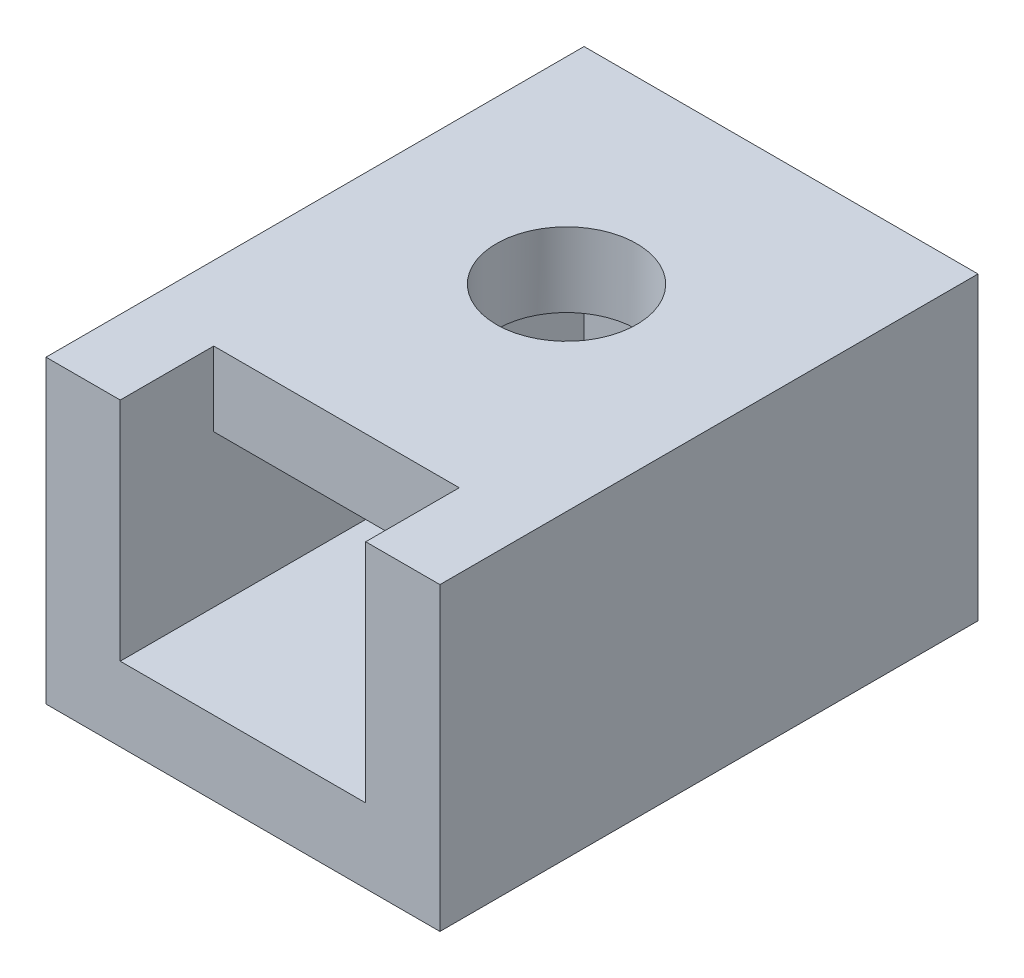
ISO-10303-21;
HEADER;
FILE_DESCRIPTION(('STEP AP214'),'2;1');
FILE_NAME('part.step','',(''),(''),'','','');
FILE_SCHEMA(('AUTOMOTIVE_DESIGN { 1 0 10303 214 1 1 1 1 }'));
ENDSEC;
DATA;
#1=APPLICATION_CONTEXT('core data for automotive mechanical design processes');
#2=APPLICATION_PROTOCOL_DEFINITION('international standard','automotive_design',2000,#1);
#3=PRODUCT_CONTEXT('',#1,'mechanical');
#4=PRODUCT('Part','Part','',(#3));
#5=PRODUCT_RELATED_PRODUCT_CATEGORY('part','',(#4));
#6=PRODUCT_DEFINITION_FORMATION('','',#4);
#7=PRODUCT_DEFINITION_CONTEXT('part definition',#1,'design');
#8=PRODUCT_DEFINITION('design','',#6,#7);
#9=PRODUCT_DEFINITION_SHAPE('','',#8);
#10=(LENGTH_UNIT() NAMED_UNIT(*) SI_UNIT(.MILLI.,.METRE.));
#11=(NAMED_UNIT(*) PLANE_ANGLE_UNIT() SI_UNIT($,.RADIAN.));
#12=(NAMED_UNIT(*) SI_UNIT($,.STERADIAN.) SOLID_ANGLE_UNIT());
#13=UNCERTAINTY_MEASURE_WITH_UNIT(LENGTH_MEASURE(1.E-05),#10,'distance_accuracy_value','');
#14=(GEOMETRIC_REPRESENTATION_CONTEXT(3) GLOBAL_UNCERTAINTY_ASSIGNED_CONTEXT((#13)) GLOBAL_UNIT_ASSIGNED_CONTEXT((#10,
#11,#12)) REPRESENTATION_CONTEXT('',''));
#15=CARTESIAN_POINT('',(0.,0.,0.));
#16=DIRECTION('',(0.,0.,1.));
#17=DIRECTION('',(1.,0.,0.));
#18=AXIS2_PLACEMENT_3D('',#15,#16,#17);
#19=CARTESIAN_POINT('',(0.,0.,19.84));
#20=DIRECTION('',(0.,0.,-1.));
#21=DIRECTION('',(-1.,0.,0.));
#22=AXIS2_PLACEMENT_3D('',#19,#20,#21);
#23=PLANE('',#22);
#24=DIRECTION('',(0.,-1.,0.));
#25=VECTOR('',#24,1.);
#26=CARTESIAN_POINT('',(-5.25,-3.25,19.84));
#27=LINE('',#26,#25);
#28=CARTESIAN_POINT('',(-5.25,6.425,19.84));
#29=VERTEX_POINT('',#28);
#30=CARTESIAN_POINT('',(-5.25,-3.25,19.84));
#31=VERTEX_POINT('',#30);
#32=EDGE_CURVE('E168',#29,#31,#27,.T.);
#33=ORIENTED_EDGE('',*,*,#32,.F.);
#34=DIRECTION('',(-1.,0.,0.));
#35=VECTOR('',#34,1.);
#36=CARTESIAN_POINT('',(0.,6.425,19.84));
#37=LINE('',#36,#35);
#38=CARTESIAN_POINT('',(-8.42500000000001,6.425,19.84));
#39=VERTEX_POINT('',#38);
#40=EDGE_CURVE('E147',#29,#39,#37,.T.);
#41=ORIENTED_EDGE('',*,*,#40,.T.);
#42=DIRECTION('',(0.,-1.,0.));
#43=VECTOR('',#42,1.);
#44=CARTESIAN_POINT('',(-8.42500000000001,0.,19.84));
#45=LINE('',#44,#43);
#46=CARTESIAN_POINT('',(-8.42500000000001,-6.425,19.84));
#47=VERTEX_POINT('',#46);
#48=EDGE_CURVE('E228',#39,#47,#45,.T.);
#49=ORIENTED_EDGE('',*,*,#48,.T.);
#50=DIRECTION('',(1.,0.,0.));
#51=VECTOR('',#50,1.);
#52=CARTESIAN_POINT('',(0.,-6.425,19.84));
#53=LINE('',#52,#51);
#54=CARTESIAN_POINT('',(8.425,-6.425,19.84));
#55=VERTEX_POINT('',#54);
#56=EDGE_CURVE('E43',#47,#55,#53,.T.);
#57=ORIENTED_EDGE('',*,*,#56,.T.);
#58=DIRECTION('',(0.,1.,0.));
#59=VECTOR('',#58,1.);
#60=CARTESIAN_POINT('',(8.425,0.,19.84));
#61=LINE('',#60,#59);
#62=CARTESIAN_POINT('',(8.425,6.425,19.84));
#63=VERTEX_POINT('',#62);
#64=EDGE_CURVE('E222',#55,#63,#61,.T.);
#65=ORIENTED_EDGE('',*,*,#64,.T.);
#66=CARTESIAN_POINT('',(5.25,6.425,19.84));
#67=VERTEX_POINT('',#66);
#68=EDGE_CURVE('E225',#63,#67,#37,.T.);
#69=ORIENTED_EDGE('',*,*,#68,.T.);
#70=DIRECTION('',(0.,1.,0.));
#71=VECTOR('',#70,1.);
#72=CARTESIAN_POINT('',(5.25,-3.25,19.84));
#73=LINE('',#72,#71);
#74=CARTESIAN_POINT('',(5.25,-3.25,19.84));
#75=VERTEX_POINT('',#74);
#76=EDGE_CURVE('E165',#75,#67,#73,.T.);
#77=ORIENTED_EDGE('',*,*,#76,.F.);
#78=DIRECTION('',(1.,0.,0.));
#79=VECTOR('',#78,1.);
#80=CARTESIAN_POINT('',(-5.25,-3.25,19.84));
#81=LINE('',#80,#79);
#82=EDGE_CURVE('E172',#31,#75,#81,.T.);
#83=ORIENTED_EDGE('',*,*,#82,.F.);
#84=EDGE_LOOP('',(#33,#41,#49,#57,#65,#69,#77,#83));
#85=FACE_BOUND('',#84,.T.);
#86=ADVANCED_FACE('F39',(#85),#23,.F.);
#87=CARTESIAN_POINT('',(8.425,-3.25,19.84));
#88=DIRECTION('',(-1.,0.,0.));
#89=DIRECTION('',(0.,0.,1.));
#90=AXIS2_PLACEMENT_3D('',#87,#88,#89);
#91=PLANE('',#90);
#92=DIRECTION('',(0.,1.,0.));
#93=VECTOR('',#92,1.);
#94=CARTESIAN_POINT('',(8.425,0.,-3.175));
#95=LINE('',#94,#93);
#96=CARTESIAN_POINT('',(8.425,-6.425,-3.175));
#97=VERTEX_POINT('',#96);
#98=CARTESIAN_POINT('',(8.425,6.425,-3.175));
#99=VERTEX_POINT('',#98);
#100=EDGE_CURVE('E198',#97,#99,#95,.T.);
#101=ORIENTED_EDGE('',*,*,#100,.T.);
#102=DIRECTION('',(0.,0.,-1.));
#103=VECTOR('',#102,1.);
#104=CARTESIAN_POINT('',(8.425,6.425,19.84));
#105=LINE('',#104,#103);
#106=EDGE_CURVE('E11',#63,#99,#105,.T.);
#107=ORIENTED_EDGE('',*,*,#106,.F.);
#108=ORIENTED_EDGE('',*,*,#64,.F.);
#109=DIRECTION('',(0.,0.,-1.));
#110=VECTOR('',#109,1.);
#111=CARTESIAN_POINT('',(8.425,-6.425,19.84));
#112=LINE('',#111,#110);
#113=EDGE_CURVE('E203',#55,#97,#112,.T.);
#114=ORIENTED_EDGE('',*,*,#113,.T.);
#115=EDGE_LOOP('',(#101,#107,#108,#114));
#116=FACE_BOUND('',#115,.T.);
#117=ADVANCED_FACE('F243',(#116),#91,.F.);
#118=CARTESIAN_POINT('',(-5.25,6.425,19.84));
#119=DIRECTION('',(0.,-1.,0.));
#120=DIRECTION('',(0.,0.,-1.));
#121=AXIS2_PLACEMENT_3D('',#118,#119,#120);
#122=PLANE('',#121);
#123=CARTESIAN_POINT('',(0.,6.425,6.));
#124=DIRECTION('',(0.,1.,0.));
#125=DIRECTION('',(0.,0.,1.));
#126=AXIS2_PLACEMENT_3D('',#123,#124,#125);
#127=CIRCLE('',#126,3.);
#128=CARTESIAN_POINT('',(0.,6.425,9.));
#129=VERTEX_POINT('',#128);
#130=EDGE_CURVE('E156',#129,#129,#127,.T.);
#131=ORIENTED_EDGE('',*,*,#130,.F.);
#132=EDGE_LOOP('',(#131));
#133=FACE_BOUND('',#132,.T.);
#134=ORIENTED_EDGE('',*,*,#40,.F.);
#135=DIRECTION('',(0.,0.,1.));
#136=VECTOR('',#135,1.);
#137=CARTESIAN_POINT('',(-5.25,6.425,19.84));
#138=LINE('',#137,#136);
#139=CARTESIAN_POINT('',(-5.25,6.425,15.84));
#140=VERTEX_POINT('',#139);
#141=EDGE_CURVE('E125',#140,#29,#138,.T.);
#142=ORIENTED_EDGE('',*,*,#141,.F.);
#143=DIRECTION('',(-1.,0.,0.));
#144=VECTOR('',#143,1.);
#145=CARTESIAN_POINT('',(-5.25,6.425,15.84));
#146=LINE('',#145,#144);
#147=CARTESIAN_POINT('',(5.25,6.425,15.84));
#148=VERTEX_POINT('',#147);
#149=EDGE_CURVE('E135',#148,#140,#146,.T.);
#150=ORIENTED_EDGE('',*,*,#149,.F.);
#151=DIRECTION('',(0.,0.,-1.));
#152=VECTOR('',#151,1.);
#153=CARTESIAN_POINT('',(5.25,6.425,19.84));
#154=LINE('',#153,#152);
#155=EDGE_CURVE('E143',#67,#148,#154,.T.);
#156=ORIENTED_EDGE('',*,*,#155,.F.);
#157=ORIENTED_EDGE('',*,*,#68,.F.);
#158=ORIENTED_EDGE('',*,*,#106,.T.);
#159=DIRECTION('',(-1.,0.,0.));
#160=VECTOR('',#159,1.);
#161=CARTESIAN_POINT('',(0.,6.425,-3.175));
#162=LINE('',#161,#160);
#163=CARTESIAN_POINT('',(-8.42500000000001,6.425,-3.175));
#164=VERTEX_POINT('',#163);
#165=EDGE_CURVE('E201',#99,#164,#162,.T.);
#166=ORIENTED_EDGE('',*,*,#165,.T.);
#167=DIRECTION('',(0.,0.,-1.));
#168=VECTOR('',#167,1.);
#169=CARTESIAN_POINT('',(-8.42500000000001,6.425,19.84));
#170=LINE('',#169,#168);
#171=EDGE_CURVE('E49',#39,#164,#170,.T.);
#172=ORIENTED_EDGE('',*,*,#171,.F.);
#173=EDGE_LOOP('',(#134,#142,#150,#156,#157,#158,#166,#172));
#174=FACE_BOUND('',#173,.T.);
#175=ADVANCED_FACE('F145',(#133,#174),#122,.F.);
#176=CARTESIAN_POINT('',(-8.42500000000001,-3.25,19.84));
#177=DIRECTION('',(1.,0.,0.));
#178=DIRECTION('',(0.,0.,-1.));
#179=AXIS2_PLACEMENT_3D('',#176,#177,#178);
#180=PLANE('',#179);
#181=DIRECTION('',(0.,-1.,0.));
#182=VECTOR('',#181,1.);
#183=CARTESIAN_POINT('',(-8.42500000000001,0.,-3.175));
#184=LINE('',#183,#182);
#185=CARTESIAN_POINT('',(-8.42500000000001,-6.425,-3.175));
#186=VERTEX_POINT('',#185);
#187=EDGE_CURVE('E210',#164,#186,#184,.T.);
#188=ORIENTED_EDGE('',*,*,#187,.T.);
#189=DIRECTION('',(0.,0.,-1.));
#190=VECTOR('',#189,1.);
#191=CARTESIAN_POINT('',(-8.42500000000001,-6.425,19.84));
#192=LINE('',#191,#190);
#193=EDGE_CURVE('E207',#47,#186,#192,.T.);
#194=ORIENTED_EDGE('',*,*,#193,.F.);
#195=ORIENTED_EDGE('',*,*,#48,.F.);
#196=ORIENTED_EDGE('',*,*,#171,.T.);
#197=EDGE_LOOP('',(#188,#194,#195,#196));
#198=FACE_BOUND('',#197,.T.);
#199=ADVANCED_FACE('F234',(#198),#180,.F.);
#200=CARTESIAN_POINT('',(-5.25,-6.425,19.84));
#201=DIRECTION('',(0.,1.,0.));
#202=DIRECTION('',(0.,0.,1.));
#203=AXIS2_PLACEMENT_3D('',#200,#201,#202);
#204=PLANE('',#203);
#205=DIRECTION('',(1.,0.,0.));
#206=VECTOR('',#205,1.);
#207=CARTESIAN_POINT('',(0.,-6.425,-3.175));
#208=LINE('',#207,#206);
#209=EDGE_CURVE('E216',#186,#97,#208,.T.);
#210=ORIENTED_EDGE('',*,*,#209,.T.);
#211=ORIENTED_EDGE('',*,*,#113,.F.);
#212=ORIENTED_EDGE('',*,*,#56,.F.);
#213=ORIENTED_EDGE('',*,*,#193,.T.);
#214=EDGE_LOOP('',(#210,#211,#212,#213));
#215=FACE_BOUND('',#214,.T.);
#216=ADVANCED_FACE('F238',(#215),#204,.F.);
#217=CARTESIAN_POINT('',(0.,0.,-3.175));
#218=DIRECTION('',(0.,0.,-1.));
#219=DIRECTION('',(-1.,0.,0.));
#220=AXIS2_PLACEMENT_3D('',#217,#218,#219);
#221=PLANE('',#220);
#222=ORIENTED_EDGE('',*,*,#100,.F.);
#223=ORIENTED_EDGE('',*,*,#209,.F.);
#224=ORIENTED_EDGE('',*,*,#187,.F.);
#225=ORIENTED_EDGE('',*,*,#165,.F.);
#226=EDGE_LOOP('',(#222,#223,#224,#225));
#227=FACE_BOUND('',#226,.T.);
#228=ADVANCED_FACE('F41',(#227),#221,.T.);
#229=CARTESIAN_POINT('',(5.25,-3.25,19.84));
#230=DIRECTION('',(-1.,0.,0.));
#231=DIRECTION('',(0.,0.,1.));
#232=AXIS2_PLACEMENT_3D('',#229,#230,#231);
#233=PLANE('',#232);
#234=DIRECTION('',(0.,1.,0.));
#235=VECTOR('',#234,1.);
#236=CARTESIAN_POINT('',(5.25,-3.25,0.));
#237=LINE('',#236,#235);
#238=CARTESIAN_POINT('',(5.25,-3.25,0.));
#239=VERTEX_POINT('',#238);
#240=CARTESIAN_POINT('',(5.25,3.25,0.));
#241=VERTEX_POINT('',#240);
#242=EDGE_CURVE('E142',#239,#241,#237,.T.);
#243=ORIENTED_EDGE('',*,*,#242,.F.);
#244=DIRECTION('',(0.,0.,-1.));
#245=VECTOR('',#244,1.);
#246=CARTESIAN_POINT('',(5.25,-3.25,19.84));
#247=LINE('',#246,#245);
#248=EDGE_CURVE('E175',#75,#239,#247,.T.);
#249=ORIENTED_EDGE('',*,*,#248,.F.);
#250=ORIENTED_EDGE('',*,*,#76,.T.);
#251=ORIENTED_EDGE('',*,*,#155,.T.);
#252=DIRECTION('',(0.,1.,0.));
#253=VECTOR('',#252,1.);
#254=CARTESIAN_POINT('',(5.25,-6.426,15.84));
#255=LINE('',#254,#253);
#256=CARTESIAN_POINT('',(5.25,3.25,15.84));
#257=VERTEX_POINT('',#256);
#258=EDGE_CURVE('E131',#257,#148,#255,.T.);
#259=ORIENTED_EDGE('',*,*,#258,.F.);
#260=DIRECTION('',(0.,0.,-1.));
#261=VECTOR('',#260,1.);
#262=CARTESIAN_POINT('',(5.25,3.25,19.84));
#263=LINE('',#262,#261);
#264=EDGE_CURVE('E195',#257,#241,#263,.T.);
#265=ORIENTED_EDGE('',*,*,#264,.T.);
#266=EDGE_LOOP('',(#243,#249,#250,#251,#259,#265));
#267=FACE_BOUND('',#266,.T.);
#268=ADVANCED_FACE('F248',(#267),#233,.T.);
#269=CARTESIAN_POINT('',(-5.25,3.25,19.84));
#270=DIRECTION('',(0.,-1.,0.));
#271=DIRECTION('',(0.,0.,-1.));
#272=AXIS2_PLACEMENT_3D('',#269,#270,#271);
#273=PLANE('',#272);
#274=DIRECTION('',(-1.,0.,0.));
#275=VECTOR('',#274,1.);
#276=CARTESIAN_POINT('',(-5.25,3.25,15.84));
#277=LINE('',#276,#275);
#278=CARTESIAN_POINT('',(-5.25,3.25,15.84));
#279=VERTEX_POINT('',#278);
#280=EDGE_CURVE('E132',#257,#279,#277,.T.);
#281=ORIENTED_EDGE('',*,*,#280,.T.);
#282=DIRECTION('',(0.,0.,-1.));
#283=VECTOR('',#282,1.);
#284=CARTESIAN_POINT('',(-5.25,3.25,19.84));
#285=LINE('',#284,#283);
#286=CARTESIAN_POINT('',(-5.25,3.25,0.));
#287=VERTEX_POINT('',#286);
#288=EDGE_CURVE('E127',#279,#287,#285,.T.);
#289=ORIENTED_EDGE('',*,*,#288,.T.);
#290=DIRECTION('',(-1.,0.,0.));
#291=VECTOR('',#290,1.);
#292=CARTESIAN_POINT('',(-5.25,3.25,0.));
#293=LINE('',#292,#291);
#294=EDGE_CURVE('E179',#241,#287,#293,.T.);
#295=ORIENTED_EDGE('',*,*,#294,.F.);
#296=ORIENTED_EDGE('',*,*,#264,.F.);
#297=EDGE_LOOP('',(#281,#289,#295,#296));
#298=FACE_BOUND('',#297,.T.);
#299=CARTESIAN_POINT('',(0.,3.25,6.));
#300=DIRECTION('',(0.,-1.,0.));
#301=DIRECTION('',(0.,0.,-1.));
#302=AXIS2_PLACEMENT_3D('',#299,#300,#301);
#303=CIRCLE('',#302,3.);
#304=CARTESIAN_POINT('',(0.,3.25,3.));
#305=VERTEX_POINT('',#304);
#306=EDGE_CURVE('E158',#305,#305,#303,.F.);
#307=ORIENTED_EDGE('',*,*,#306,.T.);
#308=EDGE_LOOP('',(#307));
#309=FACE_BOUND('',#308,.T.);
#310=ADVANCED_FACE('F256',(#298,#309),#273,.T.);
#311=CARTESIAN_POINT('',(-5.25,-3.25,19.84));
#312=DIRECTION('',(1.,0.,0.));
#313=DIRECTION('',(0.,0.,-1.));
#314=AXIS2_PLACEMENT_3D('',#311,#312,#313);
#315=PLANE('',#314);
#316=DIRECTION('',(0.,-1.,0.));
#317=VECTOR('',#316,1.);
#318=CARTESIAN_POINT('',(-5.25,-3.25,0.));
#319=LINE('',#318,#317);
#320=CARTESIAN_POINT('',(-5.25,-3.25,0.));
#321=VERTEX_POINT('',#320);
#322=EDGE_CURVE('E183',#287,#321,#319,.T.);
#323=ORIENTED_EDGE('',*,*,#322,.F.);
#324=ORIENTED_EDGE('',*,*,#288,.F.);
#325=DIRECTION('',(0.,1.,0.));
#326=VECTOR('',#325,1.);
#327=CARTESIAN_POINT('',(-5.25,-6.426,15.84));
#328=LINE('',#327,#326);
#329=EDGE_CURVE('E120',#279,#140,#328,.T.);
#330=ORIENTED_EDGE('',*,*,#329,.T.);
#331=ORIENTED_EDGE('',*,*,#141,.T.);
#332=ORIENTED_EDGE('',*,*,#32,.T.);
#333=DIRECTION('',(0.,0.,-1.));
#334=VECTOR('',#333,1.);
#335=CARTESIAN_POINT('',(-5.25,-3.25,19.84));
#336=LINE('',#335,#334);
#337=EDGE_CURVE('E57',#31,#321,#336,.T.);
#338=ORIENTED_EDGE('',*,*,#337,.T.);
#339=EDGE_LOOP('',(#323,#324,#330,#331,#332,#338));
#340=FACE_BOUND('',#339,.T.);
#341=ADVANCED_FACE('F123',(#340),#315,.T.);
#342=CARTESIAN_POINT('',(-5.25,-3.25,19.84));
#343=DIRECTION('',(0.,1.,0.));
#344=DIRECTION('',(0.,0.,1.));
#345=AXIS2_PLACEMENT_3D('',#342,#343,#344);
#346=PLANE('',#345);
#347=DIRECTION('',(1.,0.,0.));
#348=VECTOR('',#347,1.);
#349=CARTESIAN_POINT('',(-5.25,-3.25,0.));
#350=LINE('',#349,#348);
#351=EDGE_CURVE('E169',#321,#239,#350,.T.);
#352=ORIENTED_EDGE('',*,*,#351,.F.);
#353=ORIENTED_EDGE('',*,*,#337,.F.);
#354=ORIENTED_EDGE('',*,*,#82,.T.);
#355=ORIENTED_EDGE('',*,*,#248,.T.);
#356=EDGE_LOOP('',(#352,#353,#354,#355));
#357=FACE_BOUND('',#356,.T.);
#358=ADVANCED_FACE('F251',(#357),#346,.T.);
#359=CARTESIAN_POINT('',(0.,0.,0.));
#360=DIRECTION('',(0.,0.,-1.));
#361=DIRECTION('',(-1.,0.,0.));
#362=AXIS2_PLACEMENT_3D('',#359,#360,#361);
#363=PLANE('',#362);
#364=ORIENTED_EDGE('',*,*,#242,.T.);
#365=ORIENTED_EDGE('',*,*,#294,.T.);
#366=ORIENTED_EDGE('',*,*,#322,.T.);
#367=ORIENTED_EDGE('',*,*,#351,.T.);
#368=EDGE_LOOP('',(#364,#365,#366,#367));
#369=FACE_BOUND('',#368,.T.);
#370=ADVANCED_FACE('F253',(#369),#363,.F.);
#371=CARTESIAN_POINT('',(-5.25,-6.426,15.84));
#372=DIRECTION('',(0.,0.,-1.));
#373=DIRECTION('',(-1.,0.,0.));
#374=AXIS2_PLACEMENT_3D('',#371,#372,#373);
#375=PLANE('',#374);
#376=ORIENTED_EDGE('',*,*,#258,.T.);
#377=ORIENTED_EDGE('',*,*,#149,.T.);
#378=ORIENTED_EDGE('',*,*,#329,.F.);
#379=ORIENTED_EDGE('',*,*,#280,.F.);
#380=EDGE_LOOP('',(#376,#377,#378,#379));
#381=FACE_BOUND('',#380,.T.);
#382=ADVANCED_FACE('F136',(#381),#375,.F.);
#383=CARTESIAN_POINT('',(0.,-6.426,6.));
#384=DIRECTION('',(0.,1.,0.));
#385=DIRECTION('',(0.,0.,1.));
#386=AXIS2_PLACEMENT_3D('',#383,#384,#385);
#387=CYLINDRICAL_SURFACE('',#386,3.);
#388=ORIENTED_EDGE('',*,*,#306,.F.);
#389=EDGE_LOOP('',(#388));
#390=FACE_BOUND('',#389,.T.);
#391=ORIENTED_EDGE('',*,*,#130,.T.);
#392=EDGE_LOOP('',(#391));
#393=FACE_BOUND('',#392,.T.);
#394=ADVANCED_FACE('F262',(#390,#393),#387,.F.);
#395=CLOSED_SHELL('',(#86,#117,#175,#199,#216,#228,#268,#310,#341,#358,#370,#382,#394));
#396=MANIFOLD_SOLID_BREP('B2',#395);
#397=ADVANCED_BREP_SHAPE_REPRESENTATION('',(#18,#396),#14);
#398=SHAPE_DEFINITION_REPRESENTATION(#9,#397);
ENDSEC;
END-ISO-10303-21;
